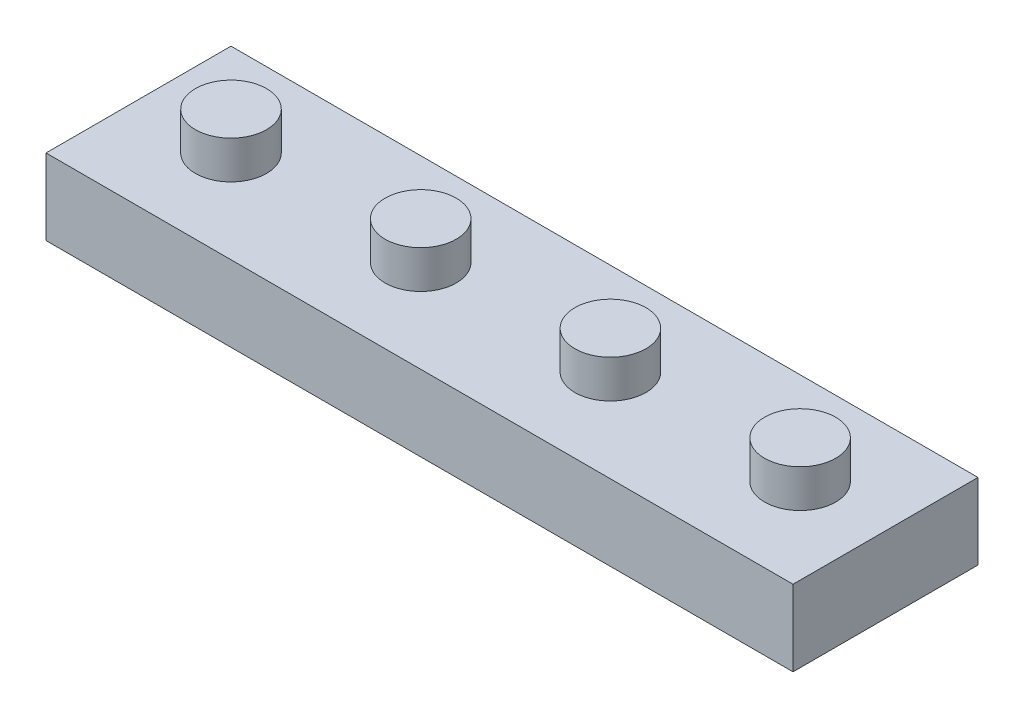
ISO-10303-21;
HEADER;
FILE_DESCRIPTION(('STEP AP214'),'2;1');
FILE_NAME('part.step','',(''),(''),'','','');
FILE_SCHEMA(('AUTOMOTIVE_DESIGN { 1 0 10303 214 1 1 1 1 }'));
ENDSEC;
DATA;
#1=APPLICATION_CONTEXT('core data for automotive mechanical design processes');
#2=APPLICATION_PROTOCOL_DEFINITION('international standard','automotive_design',2000,#1);
#3=PRODUCT_CONTEXT('',#1,'mechanical');
#4=PRODUCT('Part','Part','',(#3));
#5=PRODUCT_RELATED_PRODUCT_CATEGORY('part','',(#4));
#6=PRODUCT_DEFINITION_FORMATION('','',#4);
#7=PRODUCT_DEFINITION_CONTEXT('part definition',#1,'design');
#8=PRODUCT_DEFINITION('design','',#6,#7);
#9=PRODUCT_DEFINITION_SHAPE('','',#8);
#10=(LENGTH_UNIT() NAMED_UNIT(*) SI_UNIT(.MILLI.,.METRE.));
#11=(NAMED_UNIT(*) PLANE_ANGLE_UNIT() SI_UNIT($,.RADIAN.));
#12=(NAMED_UNIT(*) SI_UNIT($,.STERADIAN.) SOLID_ANGLE_UNIT());
#13=UNCERTAINTY_MEASURE_WITH_UNIT(LENGTH_MEASURE(1.E-05),#10,'distance_accuracy_value','');
#14=(GEOMETRIC_REPRESENTATION_CONTEXT(3) GLOBAL_UNCERTAINTY_ASSIGNED_CONTEXT((#13)) GLOBAL_UNIT_ASSIGNED_CONTEXT((#10,
#11,#12)) REPRESENTATION_CONTEXT('',''));
#15=CARTESIAN_POINT('',(0.,0.,0.));
#16=DIRECTION('',(0.,0.,1.));
#17=DIRECTION('',(1.,0.,0.));
#18=AXIS2_PLACEMENT_3D('',#15,#16,#17);
#19=CARTESIAN_POINT('',(0.,0.,-7.8));
#20=DIRECTION('',(0.,-1.,0.));
#21=DIRECTION('',(0.,0.,-1.));
#22=AXIS2_PLACEMENT_3D('',#19,#20,#21);
#23=PLANE('',#22);
#24=DIRECTION('',(1.,0.,0.));
#25=VECTOR('',#24,1.);
#26=CARTESIAN_POINT('',(0.,0.,0.));
#27=LINE('',#26,#25);
#28=CARTESIAN_POINT('',(0.,0.,0.));
#29=VERTEX_POINT('',#28);
#30=CARTESIAN_POINT('',(31.5,0.,0.));
#31=VERTEX_POINT('',#30);
#32=EDGE_CURVE('E223',#29,#31,#27,.T.);
#33=ORIENTED_EDGE('',*,*,#32,.F.);
#34=DIRECTION('',(0.,0.,1.));
#35=VECTOR('',#34,1.);
#36=CARTESIAN_POINT('',(0.,0.,-7.8));
#37=LINE('',#36,#35);
#38=CARTESIAN_POINT('',(0.,0.,-7.8));
#39=VERTEX_POINT('',#38);
#40=EDGE_CURVE('E94',#39,#29,#37,.T.);
#41=ORIENTED_EDGE('',*,*,#40,.F.);
#42=DIRECTION('',(1.,0.,0.));
#43=VECTOR('',#42,1.);
#44=CARTESIAN_POINT('',(0.,0.,-7.8));
#45=LINE('',#44,#43);
#46=CARTESIAN_POINT('',(31.5,0.,-7.8));
#47=VERTEX_POINT('',#46);
#48=EDGE_CURVE('E209',#39,#47,#45,.T.);
#49=ORIENTED_EDGE('',*,*,#48,.T.);
#50=DIRECTION('',(0.,0.,1.));
#51=VECTOR('',#50,1.);
#52=CARTESIAN_POINT('',(31.5,0.,-7.8));
#53=LINE('',#52,#51);
#54=EDGE_CURVE('E240',#47,#31,#53,.T.);
#55=ORIENTED_EDGE('',*,*,#54,.T.);
#56=EDGE_LOOP('',(#33,#41,#49,#55));
#57=FACE_BOUND('',#56,.T.);
#58=DIRECTION('',(0.,0.,1.));
#59=VECTOR('',#58,1.);
#60=CARTESIAN_POINT('',(1.2,0.,-7.8));
#61=LINE('',#60,#59);
#62=CARTESIAN_POINT('',(1.2,0.,-6.6));
#63=VERTEX_POINT('',#62);
#64=CARTESIAN_POINT('',(1.2,0.,-1.2));
#65=VERTEX_POINT('',#64);
#66=EDGE_CURVE('E142',#63,#65,#61,.T.);
#67=ORIENTED_EDGE('',*,*,#66,.T.);
#68=DIRECTION('',(1.,0.,0.));
#69=VECTOR('',#68,1.);
#70=CARTESIAN_POINT('',(0.,0.,-1.2));
#71=LINE('',#70,#69);
#72=CARTESIAN_POINT('',(30.3,0.,-1.2));
#73=VERTEX_POINT('',#72);
#74=EDGE_CURVE('E164',#65,#73,#71,.T.);
#75=ORIENTED_EDGE('',*,*,#74,.T.);
#76=DIRECTION('',(0.,0.,1.));
#77=VECTOR('',#76,1.);
#78=CARTESIAN_POINT('',(30.3,0.,-7.8));
#79=LINE('',#78,#77);
#80=CARTESIAN_POINT('',(30.3,0.,-6.6));
#81=VERTEX_POINT('',#80);
#82=EDGE_CURVE('E131',#81,#73,#79,.T.);
#83=ORIENTED_EDGE('',*,*,#82,.F.);
#84=DIRECTION('',(1.,0.,0.));
#85=VECTOR('',#84,1.);
#86=CARTESIAN_POINT('',(0.,0.,-6.6));
#87=LINE('',#86,#85);
#88=EDGE_CURVE('E59',#63,#81,#87,.T.);
#89=ORIENTED_EDGE('',*,*,#88,.F.);
#90=EDGE_LOOP('',(#67,#75,#83,#89));
#91=FACE_BOUND('',#90,.T.);
#92=ADVANCED_FACE('F43',(#57,#91),#23,.T.);
#93=CARTESIAN_POINT('',(27.9,4.8,-3.9));
#94=DIRECTION('',(0.,1.,0.));
#95=DIRECTION('',(0.,0.,1.));
#96=AXIS2_PLACEMENT_3D('',#93,#94,#95);
#97=PLANE('',#96);
#98=CARTESIAN_POINT('',(27.9,4.8,-3.9));
#99=DIRECTION('',(0.,1.,0.));
#100=DIRECTION('',(0.,0.,1.));
#101=AXIS2_PLACEMENT_3D('',#98,#99,#100);
#102=CIRCLE('',#101,1.5);
#103=CARTESIAN_POINT('',(27.9,4.8,-2.4));
#104=VERTEX_POINT('',#103);
#105=EDGE_CURVE('E256',#104,#104,#102,.T.);
#106=ORIENTED_EDGE('',*,*,#105,.T.);
#107=EDGE_LOOP('',(#106));
#108=FACE_BOUND('',#107,.T.);
#109=ADVANCED_FACE('F45',(#108),#97,.T.);
#110=CARTESIAN_POINT('',(27.9,4.8,-3.9));
#111=DIRECTION('',(0.,-1.,0.));
#112=DIRECTION('',(0.,0.,-1.));
#113=AXIS2_PLACEMENT_3D('',#110,#111,#112);
#114=CYLINDRICAL_SURFACE('',#113,1.5);
#115=ORIENTED_EDGE('',*,*,#105,.F.);
#116=EDGE_LOOP('',(#115));
#117=FACE_BOUND('',#116,.T.);
#118=CARTESIAN_POINT('',(27.9,3.2,-3.9));
#119=DIRECTION('',(0.,1.,0.));
#120=DIRECTION('',(0.,0.,1.));
#121=AXIS2_PLACEMENT_3D('',#118,#119,#120);
#122=CIRCLE('',#121,1.5);
#123=CARTESIAN_POINT('',(27.9,3.2,-2.4));
#124=VERTEX_POINT('',#123);
#125=EDGE_CURVE('E252',#124,#124,#122,.T.);
#126=ORIENTED_EDGE('',*,*,#125,.T.);
#127=EDGE_LOOP('',(#126));
#128=FACE_BOUND('',#127,.T.);
#129=ADVANCED_FACE('F300',(#117,#128),#114,.T.);
#130=CARTESIAN_POINT('',(19.9,4.8,-3.9));
#131=DIRECTION('',(0.,1.,0.));
#132=DIRECTION('',(0.,0.,1.));
#133=AXIS2_PLACEMENT_3D('',#130,#131,#132);
#134=PLANE('',#133);
#135=CARTESIAN_POINT('',(19.9,4.8,-3.9));
#136=DIRECTION('',(0.,1.,0.));
#137=DIRECTION('',(0.,0.,1.));
#138=AXIS2_PLACEMENT_3D('',#135,#136,#137);
#139=CIRCLE('',#138,1.5);
#140=CARTESIAN_POINT('',(19.9,4.8,-2.4));
#141=VERTEX_POINT('',#140);
#142=EDGE_CURVE('E248',#141,#141,#139,.T.);
#143=ORIENTED_EDGE('',*,*,#142,.T.);
#144=EDGE_LOOP('',(#143));
#145=FACE_BOUND('',#144,.T.);
#146=ADVANCED_FACE('F313',(#145),#134,.T.);
#147=CARTESIAN_POINT('',(19.9,4.8,-3.9));
#148=DIRECTION('',(0.,-1.,0.));
#149=DIRECTION('',(0.,0.,-1.));
#150=AXIS2_PLACEMENT_3D('',#147,#148,#149);
#151=CYLINDRICAL_SURFACE('',#150,1.5);
#152=ORIENTED_EDGE('',*,*,#142,.F.);
#153=EDGE_LOOP('',(#152));
#154=FACE_BOUND('',#153,.T.);
#155=CARTESIAN_POINT('',(19.9,3.2,-3.9));
#156=DIRECTION('',(0.,1.,0.));
#157=DIRECTION('',(0.,0.,1.));
#158=AXIS2_PLACEMENT_3D('',#155,#156,#157);
#159=CIRCLE('',#158,1.5);
#160=CARTESIAN_POINT('',(19.9,3.2,-2.4));
#161=VERTEX_POINT('',#160);
#162=EDGE_CURVE('E236',#161,#161,#159,.T.);
#163=ORIENTED_EDGE('',*,*,#162,.T.);
#164=EDGE_LOOP('',(#163));
#165=FACE_BOUND('',#164,.T.);
#166=ADVANCED_FACE('F310',(#154,#165),#151,.T.);
#167=CARTESIAN_POINT('',(0.,0.,-7.8));
#168=DIRECTION('',(-1.,0.,0.));
#169=DIRECTION('',(0.,0.,1.));
#170=AXIS2_PLACEMENT_3D('',#167,#168,#169);
#171=PLANE('',#170);
#172=DIRECTION('',(0.,-1.,0.));
#173=VECTOR('',#172,1.);
#174=CARTESIAN_POINT('',(0.,0.,0.));
#175=LINE('',#174,#173);
#176=CARTESIAN_POINT('',(0.,3.2,0.));
#177=VERTEX_POINT('',#176);
#178=EDGE_CURVE('E202',#177,#29,#175,.T.);
#179=ORIENTED_EDGE('',*,*,#178,.F.);
#180=DIRECTION('',(0.,0.,1.));
#181=VECTOR('',#180,1.);
#182=CARTESIAN_POINT('',(0.,3.2,-7.8));
#183=LINE('',#182,#181);
#184=CARTESIAN_POINT('',(0.,3.2,-7.8));
#185=VERTEX_POINT('',#184);
#186=EDGE_CURVE('E68',#185,#177,#183,.T.);
#187=ORIENTED_EDGE('',*,*,#186,.F.);
#188=DIRECTION('',(0.,-1.,0.));
#189=VECTOR('',#188,1.);
#190=CARTESIAN_POINT('',(0.,0.,-7.8));
#191=LINE('',#190,#189);
#192=EDGE_CURVE('E206',#185,#39,#191,.T.);
#193=ORIENTED_EDGE('',*,*,#192,.T.);
#194=ORIENTED_EDGE('',*,*,#40,.T.);
#195=EDGE_LOOP('',(#179,#187,#193,#194));
#196=FACE_BOUND('',#195,.T.);
#197=ADVANCED_FACE('F306',(#196),#171,.T.);
#198=CARTESIAN_POINT('',(0.,3.2,-7.8));
#199=DIRECTION('',(0.,1.,0.));
#200=DIRECTION('',(0.,0.,1.));
#201=AXIS2_PLACEMENT_3D('',#198,#199,#200);
#202=PLANE('',#201);
#203=CARTESIAN_POINT('',(11.9,3.2,-3.9));
#204=DIRECTION('',(0.,1.,0.));
#205=DIRECTION('',(0.,0.,1.));
#206=AXIS2_PLACEMENT_3D('',#203,#204,#205);
#207=CIRCLE('',#206,1.5);
#208=CARTESIAN_POINT('',(11.9,3.2,-2.4));
#209=VERTEX_POINT('',#208);
#210=EDGE_CURVE('E188',#209,#209,#207,.T.);
#211=ORIENTED_EDGE('',*,*,#210,.F.);
#212=EDGE_LOOP('',(#211));
#213=FACE_BOUND('',#212,.T.);
#214=CARTESIAN_POINT('',(3.9,3.2,-3.9));
#215=DIRECTION('',(0.,1.,0.));
#216=DIRECTION('',(0.,0.,1.));
#217=AXIS2_PLACEMENT_3D('',#214,#215,#216);
#218=CIRCLE('',#217,1.5);
#219=CARTESIAN_POINT('',(3.9,3.2,-2.4));
#220=VERTEX_POINT('',#219);
#221=EDGE_CURVE('E197',#220,#220,#218,.T.);
#222=ORIENTED_EDGE('',*,*,#221,.F.);
#223=EDGE_LOOP('',(#222));
#224=FACE_BOUND('',#223,.T.);
#225=DIRECTION('',(-1.,0.,0.));
#226=VECTOR('',#225,1.);
#227=CARTESIAN_POINT('',(0.,3.2,0.));
#228=LINE('',#227,#226);
#229=CARTESIAN_POINT('',(31.5,3.2,0.));
#230=VERTEX_POINT('',#229);
#231=EDGE_CURVE('E210',#230,#177,#228,.T.);
#232=ORIENTED_EDGE('',*,*,#231,.F.);
#233=DIRECTION('',(0.,0.,1.));
#234=VECTOR('',#233,1.);
#235=CARTESIAN_POINT('',(31.5,3.2,-7.8));
#236=LINE('',#235,#234);
#237=CARTESIAN_POINT('',(31.5,3.2,-7.8));
#238=VERTEX_POINT('',#237);
#239=EDGE_CURVE('E237',#238,#230,#236,.T.);
#240=ORIENTED_EDGE('',*,*,#239,.F.);
#241=DIRECTION('',(-1.,0.,0.));
#242=VECTOR('',#241,1.);
#243=CARTESIAN_POINT('',(0.,3.2,-7.8));
#244=LINE('',#243,#242);
#245=EDGE_CURVE('E217',#238,#185,#244,.T.);
#246=ORIENTED_EDGE('',*,*,#245,.T.);
#247=ORIENTED_EDGE('',*,*,#186,.T.);
#248=EDGE_LOOP('',(#232,#240,#246,#247));
#249=FACE_BOUND('',#248,.T.);
#250=ORIENTED_EDGE('',*,*,#162,.F.);
#251=EDGE_LOOP('',(#250));
#252=FACE_BOUND('',#251,.T.);
#253=ORIENTED_EDGE('',*,*,#125,.F.);
#254=EDGE_LOOP('',(#253));
#255=FACE_BOUND('',#254,.T.);
#256=ADVANCED_FACE('F309',(#213,#224,#249,#252,#255),#202,.T.);
#257=CARTESIAN_POINT('',(31.5,0.,-7.8));
#258=DIRECTION('',(1.,0.,0.));
#259=DIRECTION('',(0.,0.,-1.));
#260=AXIS2_PLACEMENT_3D('',#257,#258,#259);
#261=PLANE('',#260);
#262=DIRECTION('',(0.,1.,0.));
#263=VECTOR('',#262,1.);
#264=CARTESIAN_POINT('',(31.5,0.,0.));
#265=LINE('',#264,#263);
#266=EDGE_CURVE('E227',#31,#230,#265,.T.);
#267=ORIENTED_EDGE('',*,*,#266,.F.);
#268=ORIENTED_EDGE('',*,*,#54,.F.);
#269=DIRECTION('',(0.,1.,0.));
#270=VECTOR('',#269,1.);
#271=CARTESIAN_POINT('',(31.5,0.,-7.8));
#272=LINE('',#271,#270);
#273=EDGE_CURVE('E213',#47,#238,#272,.T.);
#274=ORIENTED_EDGE('',*,*,#273,.T.);
#275=ORIENTED_EDGE('',*,*,#239,.T.);
#276=EDGE_LOOP('',(#267,#268,#274,#275));
#277=FACE_BOUND('',#276,.T.);
#278=ADVANCED_FACE('F304',(#277),#261,.T.);
#279=CARTESIAN_POINT('',(0.,0.,-7.8));
#280=DIRECTION('',(0.,0.,-1.));
#281=DIRECTION('',(-1.,0.,0.));
#282=AXIS2_PLACEMENT_3D('',#279,#280,#281);
#283=PLANE('',#282);
#284=ORIENTED_EDGE('',*,*,#192,.F.);
#285=ORIENTED_EDGE('',*,*,#245,.F.);
#286=ORIENTED_EDGE('',*,*,#273,.F.);
#287=ORIENTED_EDGE('',*,*,#48,.F.);
#288=EDGE_LOOP('',(#284,#285,#286,#287));
#289=FACE_BOUND('',#288,.T.);
#290=ADVANCED_FACE('F330',(#289),#283,.T.);
#291=CARTESIAN_POINT('',(0.,0.,0.));
#292=DIRECTION('',(0.,0.,-1.));
#293=DIRECTION('',(-1.,0.,0.));
#294=AXIS2_PLACEMENT_3D('',#291,#292,#293);
#295=PLANE('',#294);
#296=ORIENTED_EDGE('',*,*,#178,.T.);
#297=ORIENTED_EDGE('',*,*,#32,.T.);
#298=ORIENTED_EDGE('',*,*,#266,.T.);
#299=ORIENTED_EDGE('',*,*,#231,.T.);
#300=EDGE_LOOP('',(#296,#297,#298,#299));
#301=FACE_BOUND('',#300,.T.);
#302=ADVANCED_FACE('F335',(#301),#295,.F.);
#303=CARTESIAN_POINT('',(3.9,4.8,-3.9));
#304=DIRECTION('',(0.,-1.,0.));
#305=DIRECTION('',(0.,0.,-1.));
#306=AXIS2_PLACEMENT_3D('',#303,#304,#305);
#307=CYLINDRICAL_SURFACE('',#306,1.5);
#308=CARTESIAN_POINT('',(3.9,4.8,-3.9));
#309=DIRECTION('',(0.,1.,0.));
#310=DIRECTION('',(0.,0.,1.));
#311=AXIS2_PLACEMENT_3D('',#308,#309,#310);
#312=CIRCLE('',#311,1.5);
#313=CARTESIAN_POINT('',(3.9,4.8,-2.4));
#314=VERTEX_POINT('',#313);
#315=EDGE_CURVE('E198',#314,#314,#312,.T.);
#316=ORIENTED_EDGE('',*,*,#315,.F.);
#317=EDGE_LOOP('',(#316));
#318=FACE_BOUND('',#317,.T.);
#319=ORIENTED_EDGE('',*,*,#221,.T.);
#320=EDGE_LOOP('',(#319));
#321=FACE_BOUND('',#320,.T.);
#322=ADVANCED_FACE('F338',(#318,#321),#307,.T.);
#323=CARTESIAN_POINT('',(3.9,4.8,-3.9));
#324=DIRECTION('',(0.,1.,0.));
#325=DIRECTION('',(0.,0.,1.));
#326=AXIS2_PLACEMENT_3D('',#323,#324,#325);
#327=PLANE('',#326);
#328=ORIENTED_EDGE('',*,*,#315,.T.);
#329=EDGE_LOOP('',(#328));
#330=FACE_BOUND('',#329,.T.);
#331=ADVANCED_FACE('F345',(#330),#327,.T.);
#332=CARTESIAN_POINT('',(11.9,4.8,-3.9));
#333=DIRECTION('',(0.,-1.,0.));
#334=DIRECTION('',(0.,0.,-1.));
#335=AXIS2_PLACEMENT_3D('',#332,#333,#334);
#336=CYLINDRICAL_SURFACE('',#335,1.5);
#337=CARTESIAN_POINT('',(11.9,4.8,-3.9));
#338=DIRECTION('',(0.,1.,0.));
#339=DIRECTION('',(0.,0.,1.));
#340=AXIS2_PLACEMENT_3D('',#337,#338,#339);
#341=CIRCLE('',#340,1.5);
#342=CARTESIAN_POINT('',(11.9,4.8,-2.4));
#343=VERTEX_POINT('',#342);
#344=EDGE_CURVE('E192',#343,#343,#341,.T.);
#345=ORIENTED_EDGE('',*,*,#344,.F.);
#346=EDGE_LOOP('',(#345));
#347=FACE_BOUND('',#346,.T.);
#348=ORIENTED_EDGE('',*,*,#210,.T.);
#349=EDGE_LOOP('',(#348));
#350=FACE_BOUND('',#349,.T.);
#351=ADVANCED_FACE('F349',(#347,#350),#336,.T.);
#352=CARTESIAN_POINT('',(11.9,4.8,-3.9));
#353=DIRECTION('',(0.,1.,0.));
#354=DIRECTION('',(0.,0.,1.));
#355=AXIS2_PLACEMENT_3D('',#352,#353,#354);
#356=PLANE('',#355);
#357=ORIENTED_EDGE('',*,*,#344,.T.);
#358=EDGE_LOOP('',(#357));
#359=FACE_BOUND('',#358,.T.);
#360=ADVANCED_FACE('F353',(#359),#356,.T.);
#361=CARTESIAN_POINT('',(27.9,3.6,-3.9));
#362=DIRECTION('',(0.,1.,0.));
#363=DIRECTION('',(0.,0.,1.));
#364=AXIS2_PLACEMENT_3D('',#361,#362,#363);
#365=PLANE('',#364);
#366=CARTESIAN_POINT('',(27.9,3.6,-3.9));
#367=DIRECTION('',(0.,1.,0.));
#368=DIRECTION('',(0.,0.,1.));
#369=AXIS2_PLACEMENT_3D('',#366,#367,#368);
#370=CIRCLE('',#369,0.300000000000001);
#371=CARTESIAN_POINT('',(27.9,3.6,-3.6));
#372=VERTEX_POINT('',#371);
#373=EDGE_CURVE('E193',#372,#372,#370,.T.);
#374=ORIENTED_EDGE('',*,*,#373,.F.);
#375=EDGE_LOOP('',(#374));
#376=FACE_BOUND('',#375,.T.);
#377=ADVANCED_FACE('F357',(#376),#365,.F.);
#378=CARTESIAN_POINT('',(27.9,4.8,-3.9));
#379=DIRECTION('',(0.,-1.,0.));
#380=DIRECTION('',(0.,0.,-1.));
#381=AXIS2_PLACEMENT_3D('',#378,#379,#380);
#382=CYLINDRICAL_SURFACE('',#381,0.300000000000001);
#383=ORIENTED_EDGE('',*,*,#373,.T.);
#384=EDGE_LOOP('',(#383));
#385=FACE_BOUND('',#384,.T.);
#386=CARTESIAN_POINT('',(27.9,2.,-3.9));
#387=DIRECTION('',(0.,1.,0.));
#388=DIRECTION('',(0.,0.,1.));
#389=AXIS2_PLACEMENT_3D('',#386,#387,#388);
#390=CIRCLE('',#389,0.300000000000001);
#391=CARTESIAN_POINT('',(27.9,2.,-3.6));
#392=VERTEX_POINT('',#391);
#393=EDGE_CURVE('E159',#392,#392,#390,.T.);
#394=ORIENTED_EDGE('',*,*,#393,.F.);
#395=EDGE_LOOP('',(#394));
#396=FACE_BOUND('',#395,.T.);
#397=ADVANCED_FACE('F391',(#385,#396),#382,.F.);
#398=CARTESIAN_POINT('',(19.9,3.6,-3.9));
#399=DIRECTION('',(0.,1.,0.));
#400=DIRECTION('',(0.,0.,1.));
#401=AXIS2_PLACEMENT_3D('',#398,#399,#400);
#402=PLANE('',#401);
#403=CARTESIAN_POINT('',(19.9,3.6,-3.9));
#404=DIRECTION('',(0.,1.,0.));
#405=DIRECTION('',(0.,0.,1.));
#406=AXIS2_PLACEMENT_3D('',#403,#404,#405);
#407=CIRCLE('',#406,0.300000000000001);
#408=CARTESIAN_POINT('',(19.9,3.6,-3.6));
#409=VERTEX_POINT('',#408);
#410=EDGE_CURVE('E155',#409,#409,#407,.T.);
#411=ORIENTED_EDGE('',*,*,#410,.F.);
#412=EDGE_LOOP('',(#411));
#413=FACE_BOUND('',#412,.T.);
#414=ADVANCED_FACE('F387',(#413),#402,.F.);
#415=CARTESIAN_POINT('',(19.9,4.8,-3.9));
#416=DIRECTION('',(0.,-1.,0.));
#417=DIRECTION('',(0.,0.,-1.));
#418=AXIS2_PLACEMENT_3D('',#415,#416,#417);
#419=CYLINDRICAL_SURFACE('',#418,0.300000000000001);
#420=ORIENTED_EDGE('',*,*,#410,.T.);
#421=EDGE_LOOP('',(#420));
#422=FACE_BOUND('',#421,.T.);
#423=CARTESIAN_POINT('',(19.9,2.,-3.9));
#424=DIRECTION('',(0.,1.,0.));
#425=DIRECTION('',(0.,0.,1.));
#426=AXIS2_PLACEMENT_3D('',#423,#424,#425);
#427=CIRCLE('',#426,0.300000000000001);
#428=CARTESIAN_POINT('',(19.9,2.,-3.6));
#429=VERTEX_POINT('',#428);
#430=EDGE_CURVE('E151',#429,#429,#427,.T.);
#431=ORIENTED_EDGE('',*,*,#430,.F.);
#432=EDGE_LOOP('',(#431));
#433=FACE_BOUND('',#432,.T.);
#434=ADVANCED_FACE('F384',(#422,#433),#419,.F.);
#435=CARTESIAN_POINT('',(1.2,0.,-7.8));
#436=DIRECTION('',(-1.,0.,0.));
#437=DIRECTION('',(0.,0.,1.));
#438=AXIS2_PLACEMENT_3D('',#435,#436,#437);
#439=PLANE('',#438);
#440=DIRECTION('',(0.,-1.,0.));
#441=VECTOR('',#440,1.);
#442=CARTESIAN_POINT('',(1.2,0.,-1.2));
#443=LINE('',#442,#441);
#444=CARTESIAN_POINT('',(1.2,2.,-1.2));
#445=VERTEX_POINT('',#444);
#446=EDGE_CURVE('E160',#445,#65,#443,.T.);
#447=ORIENTED_EDGE('',*,*,#446,.T.);
#448=ORIENTED_EDGE('',*,*,#66,.F.);
#449=DIRECTION('',(0.,-1.,0.));
#450=VECTOR('',#449,1.);
#451=CARTESIAN_POINT('',(1.2,0.,-6.6));
#452=LINE('',#451,#450);
#453=CARTESIAN_POINT('',(1.2,2.,-6.6));
#454=VERTEX_POINT('',#453);
#455=EDGE_CURVE('E166',#454,#63,#452,.T.);
#456=ORIENTED_EDGE('',*,*,#455,.F.);
#457=DIRECTION('',(0.,0.,1.));
#458=VECTOR('',#457,1.);
#459=CARTESIAN_POINT('',(1.2,2.,-7.8));
#460=LINE('',#459,#458);
#461=EDGE_CURVE('E130',#454,#445,#460,.T.);
#462=ORIENTED_EDGE('',*,*,#461,.T.);
#463=EDGE_LOOP('',(#447,#448,#456,#462));
#464=FACE_BOUND('',#463,.T.);
#465=ADVANCED_FACE('F272',(#464),#439,.F.);
#466=CARTESIAN_POINT('',(0.,2.,-7.8));
#467=DIRECTION('',(0.,1.,0.));
#468=DIRECTION('',(0.,0.,1.));
#469=AXIS2_PLACEMENT_3D('',#466,#467,#468);
#470=PLANE('',#469);
#471=CARTESIAN_POINT('',(23.9,2.,-3.9));
#472=DIRECTION('',(0.,1.,0.));
#473=DIRECTION('',(0.,0.,1.));
#474=AXIS2_PLACEMENT_3D('',#471,#472,#473);
#475=CIRCLE('',#474,1.5);
#476=CARTESIAN_POINT('',(23.9,2.,-2.4));
#477=VERTEX_POINT('',#476);
#478=EDGE_CURVE('E12',#477,#477,#475,.F.);
#479=ORIENTED_EDGE('',*,*,#478,.F.);
#480=EDGE_LOOP('',(#479));
#481=FACE_BOUND('',#480,.T.);
#482=CARTESIAN_POINT('',(15.9,2.,-3.9));
#483=DIRECTION('',(0.,1.,0.));
#484=DIRECTION('',(0.,0.,1.));
#485=AXIS2_PLACEMENT_3D('',#482,#483,#484);
#486=CIRCLE('',#485,1.5);
#487=CARTESIAN_POINT('',(15.9,2.,-2.4));
#488=VERTEX_POINT('',#487);
#489=EDGE_CURVE('E52',#488,#488,#486,.F.);
#490=ORIENTED_EDGE('',*,*,#489,.F.);
#491=EDGE_LOOP('',(#490));
#492=FACE_BOUND('',#491,.T.);
#493=CARTESIAN_POINT('',(7.9,2.,-3.9));
#494=DIRECTION('',(0.,1.,0.));
#495=DIRECTION('',(0.,0.,1.));
#496=AXIS2_PLACEMENT_3D('',#493,#494,#495);
#497=CIRCLE('',#496,1.5);
#498=CARTESIAN_POINT('',(7.9,2.,-2.4));
#499=VERTEX_POINT('',#498);
#500=EDGE_CURVE('E260',#499,#499,#497,.F.);
#501=ORIENTED_EDGE('',*,*,#500,.F.);
#502=EDGE_LOOP('',(#501));
#503=FACE_BOUND('',#502,.T.);
#504=CARTESIAN_POINT('',(11.9,2.,-3.9));
#505=DIRECTION('',(0.,1.,0.));
#506=DIRECTION('',(0.,0.,1.));
#507=AXIS2_PLACEMENT_3D('',#504,#505,#506);
#508=CIRCLE('',#507,0.300000000000001);
#509=CARTESIAN_POINT('',(11.9,2.,-3.6));
#510=VERTEX_POINT('',#509);
#511=EDGE_CURVE('E179',#510,#510,#508,.T.);
#512=ORIENTED_EDGE('',*,*,#511,.T.);
#513=EDGE_LOOP('',(#512));
#514=FACE_BOUND('',#513,.T.);
#515=CARTESIAN_POINT('',(3.9,2.,-3.9));
#516=DIRECTION('',(0.,1.,0.));
#517=DIRECTION('',(0.,0.,1.));
#518=AXIS2_PLACEMENT_3D('',#515,#516,#517);
#519=CIRCLE('',#518,0.300000000000001);
#520=CARTESIAN_POINT('',(3.9,2.,-3.6));
#521=VERTEX_POINT('',#520);
#522=EDGE_CURVE('E175',#521,#521,#519,.T.);
#523=ORIENTED_EDGE('',*,*,#522,.T.);
#524=EDGE_LOOP('',(#523));
#525=FACE_BOUND('',#524,.T.);
#526=DIRECTION('',(-1.,0.,0.));
#527=VECTOR('',#526,1.);
#528=CARTESIAN_POINT('',(0.,2.,-1.2));
#529=LINE('',#528,#527);
#530=CARTESIAN_POINT('',(30.3,2.,-1.2));
#531=VERTEX_POINT('',#530);
#532=EDGE_CURVE('E168',#531,#445,#529,.T.);
#533=ORIENTED_EDGE('',*,*,#532,.T.);
#534=ORIENTED_EDGE('',*,*,#461,.F.);
#535=DIRECTION('',(-1.,0.,0.));
#536=VECTOR('',#535,1.);
#537=CARTESIAN_POINT('',(0.,2.,-6.6));
#538=LINE('',#537,#536);
#539=CARTESIAN_POINT('',(30.3,2.,-6.6));
#540=VERTEX_POINT('',#539);
#541=EDGE_CURVE('E135',#540,#454,#538,.T.);
#542=ORIENTED_EDGE('',*,*,#541,.F.);
#543=DIRECTION('',(0.,0.,1.));
#544=VECTOR('',#543,1.);
#545=CARTESIAN_POINT('',(30.3,2.,-7.8));
#546=LINE('',#545,#544);
#547=EDGE_CURVE('E119',#540,#531,#546,.T.);
#548=ORIENTED_EDGE('',*,*,#547,.T.);
#549=EDGE_LOOP('',(#533,#534,#542,#548));
#550=FACE_BOUND('',#549,.T.);
#551=ORIENTED_EDGE('',*,*,#430,.T.);
#552=EDGE_LOOP('',(#551));
#553=FACE_BOUND('',#552,.T.);
#554=ORIENTED_EDGE('',*,*,#393,.T.);
#555=EDGE_LOOP('',(#554));
#556=FACE_BOUND('',#555,.T.);
#557=ADVANCED_FACE('F138',(#481,#492,#503,#514,#525,#550,#553,#556),#470,.F.);
#558=CARTESIAN_POINT('',(30.3,0.,-7.8));
#559=DIRECTION('',(1.,0.,0.));
#560=DIRECTION('',(0.,0.,-1.));
#561=AXIS2_PLACEMENT_3D('',#558,#559,#560);
#562=PLANE('',#561);
#563=DIRECTION('',(0.,1.,0.));
#564=VECTOR('',#563,1.);
#565=CARTESIAN_POINT('',(30.3,0.,-1.2));
#566=LINE('',#565,#564);
#567=EDGE_CURVE('E124',#73,#531,#566,.T.);
#568=ORIENTED_EDGE('',*,*,#567,.T.);
#569=ORIENTED_EDGE('',*,*,#547,.F.);
#570=DIRECTION('',(0.,1.,0.));
#571=VECTOR('',#570,1.);
#572=CARTESIAN_POINT('',(30.3,0.,-6.6));
#573=LINE('',#572,#571);
#574=EDGE_CURVE('E121',#81,#540,#573,.T.);
#575=ORIENTED_EDGE('',*,*,#574,.F.);
#576=ORIENTED_EDGE('',*,*,#82,.T.);
#577=EDGE_LOOP('',(#568,#569,#575,#576));
#578=FACE_BOUND('',#577,.T.);
#579=ADVANCED_FACE('F120',(#578),#562,.F.);
#580=CARTESIAN_POINT('',(0.,0.,-6.6));
#581=DIRECTION('',(0.,0.,-1.));
#582=DIRECTION('',(-1.,0.,0.));
#583=AXIS2_PLACEMENT_3D('',#580,#581,#582);
#584=PLANE('',#583);
#585=ORIENTED_EDGE('',*,*,#455,.T.);
#586=ORIENTED_EDGE('',*,*,#88,.T.);
#587=ORIENTED_EDGE('',*,*,#574,.T.);
#588=ORIENTED_EDGE('',*,*,#541,.T.);
#589=EDGE_LOOP('',(#585,#586,#587,#588));
#590=FACE_BOUND('',#589,.T.);
#591=ADVANCED_FACE('F134',(#590),#584,.F.);
#592=CARTESIAN_POINT('',(0.,0.,-1.2));
#593=DIRECTION('',(0.,0.,-1.));
#594=DIRECTION('',(-1.,0.,0.));
#595=AXIS2_PLACEMENT_3D('',#592,#593,#594);
#596=PLANE('',#595);
#597=ORIENTED_EDGE('',*,*,#446,.F.);
#598=ORIENTED_EDGE('',*,*,#532,.F.);
#599=ORIENTED_EDGE('',*,*,#567,.F.);
#600=ORIENTED_EDGE('',*,*,#74,.F.);
#601=EDGE_LOOP('',(#597,#598,#599,#600));
#602=FACE_BOUND('',#601,.T.);
#603=ADVANCED_FACE('F292',(#602),#596,.T.);
#604=CARTESIAN_POINT('',(3.9,4.8,-3.9));
#605=DIRECTION('',(0.,-1.,0.));
#606=DIRECTION('',(0.,0.,-1.));
#607=AXIS2_PLACEMENT_3D('',#604,#605,#606);
#608=CYLINDRICAL_SURFACE('',#607,0.300000000000001);
#609=CARTESIAN_POINT('',(3.9,3.6,-3.9));
#610=DIRECTION('',(0.,1.,0.));
#611=DIRECTION('',(0.,0.,1.));
#612=AXIS2_PLACEMENT_3D('',#609,#610,#611);
#613=CIRCLE('',#612,0.300000000000001);
#614=CARTESIAN_POINT('',(3.9,3.6,-3.6));
#615=VERTEX_POINT('',#614);
#616=EDGE_CURVE('E165',#615,#615,#613,.T.);
#617=ORIENTED_EDGE('',*,*,#616,.T.);
#618=EDGE_LOOP('',(#617));
#619=FACE_BOUND('',#618,.T.);
#620=ORIENTED_EDGE('',*,*,#522,.F.);
#621=EDGE_LOOP('',(#620));
#622=FACE_BOUND('',#621,.T.);
#623=ADVANCED_FACE('F371',(#619,#622),#608,.F.);
#624=CARTESIAN_POINT('',(3.9,3.6,-3.9));
#625=DIRECTION('',(0.,1.,0.));
#626=DIRECTION('',(0.,0.,1.));
#627=AXIS2_PLACEMENT_3D('',#624,#625,#626);
#628=PLANE('',#627);
#629=ORIENTED_EDGE('',*,*,#616,.F.);
#630=EDGE_LOOP('',(#629));
#631=FACE_BOUND('',#630,.T.);
#632=ADVANCED_FACE('F367',(#631),#628,.F.);
#633=CARTESIAN_POINT('',(11.9,4.8,-3.9));
#634=DIRECTION('',(0.,-1.,0.));
#635=DIRECTION('',(0.,0.,-1.));
#636=AXIS2_PLACEMENT_3D('',#633,#634,#635);
#637=CYLINDRICAL_SURFACE('',#636,0.300000000000001);
#638=CARTESIAN_POINT('',(11.9,3.6,-3.9));
#639=DIRECTION('',(0.,1.,0.));
#640=DIRECTION('',(0.,0.,1.));
#641=AXIS2_PLACEMENT_3D('',#638,#639,#640);
#642=CIRCLE('',#641,0.300000000000001);
#643=CARTESIAN_POINT('',(11.9,3.6,-3.6));
#644=VERTEX_POINT('',#643);
#645=EDGE_CURVE('E176',#644,#644,#642,.T.);
#646=ORIENTED_EDGE('',*,*,#645,.T.);
#647=EDGE_LOOP('',(#646));
#648=FACE_BOUND('',#647,.T.);
#649=ORIENTED_EDGE('',*,*,#511,.F.);
#650=EDGE_LOOP('',(#649));
#651=FACE_BOUND('',#650,.T.);
#652=ADVANCED_FACE('F363',(#648,#651),#637,.F.);
#653=CARTESIAN_POINT('',(11.9,3.6,-3.9));
#654=DIRECTION('',(0.,1.,0.));
#655=DIRECTION('',(0.,0.,1.));
#656=AXIS2_PLACEMENT_3D('',#653,#654,#655);
#657=PLANE('',#656);
#658=ORIENTED_EDGE('',*,*,#645,.F.);
#659=EDGE_LOOP('',(#658));
#660=FACE_BOUND('',#659,.T.);
#661=ADVANCED_FACE('F359',(#660),#657,.F.);
#662=CARTESIAN_POINT('',(7.9,-4.24264068711929,-3.9));
#663=DIRECTION('',(0.,1.,0.));
#664=DIRECTION('',(0.,0.,1.));
#665=AXIS2_PLACEMENT_3D('',#662,#663,#664);
#666=CYLINDRICAL_SURFACE('',#665,1.5);
#667=ORIENTED_EDGE('',*,*,#500,.T.);
#668=EDGE_LOOP('',(#667));
#669=FACE_BOUND('',#668,.T.);
#670=CARTESIAN_POINT('',(7.9,0.2,-3.9));
#671=DIRECTION('',(0.,-1.,0.));
#672=DIRECTION('',(0.,0.,-1.));
#673=AXIS2_PLACEMENT_3D('',#670,#671,#672);
#674=CIRCLE('',#673,1.5);
#675=CARTESIAN_POINT('',(7.9,0.2,-5.4));
#676=VERTEX_POINT('',#675);
#677=EDGE_CURVE('E466',#676,#676,#674,.T.);
#678=ORIENTED_EDGE('',*,*,#677,.F.);
#679=EDGE_LOOP('',(#678));
#680=FACE_BOUND('',#679,.T.);
#681=ADVANCED_FACE('F362',(#669,#680),#666,.T.);
#682=CARTESIAN_POINT('',(7.9,-4.24264068711929,-3.9));
#683=DIRECTION('',(0.,1.,0.));
#684=DIRECTION('',(0.,0.,1.));
#685=AXIS2_PLACEMENT_3D('',#682,#683,#684);
#686=CYLINDRICAL_SURFACE('',#685,0.6);
#687=CARTESIAN_POINT('',(7.9,2.,-3.9));
#688=DIRECTION('',(0.,-1.,0.));
#689=DIRECTION('',(0.,0.,-1.));
#690=AXIS2_PLACEMENT_3D('',#687,#688,#689);
#691=CIRCLE('',#690,0.6);
#692=CARTESIAN_POINT('',(7.9,2.,-4.5));
#693=VERTEX_POINT('',#692);
#694=EDGE_CURVE('E470',#693,#693,#691,.T.);
#695=ORIENTED_EDGE('',*,*,#694,.F.);
#696=EDGE_LOOP('',(#695));
#697=FACE_BOUND('',#696,.T.);
#698=CARTESIAN_POINT('',(7.9,0.2,-3.9));
#699=DIRECTION('',(0.,-1.,0.));
#700=DIRECTION('',(0.,0.,-1.));
#701=AXIS2_PLACEMENT_3D('',#698,#699,#700);
#702=CIRCLE('',#701,0.6);
#703=CARTESIAN_POINT('',(7.9,0.2,-4.5));
#704=VERTEX_POINT('',#703);
#705=EDGE_CURVE('E462',#704,#704,#702,.T.);
#706=ORIENTED_EDGE('',*,*,#705,.T.);
#707=EDGE_LOOP('',(#706));
#708=FACE_BOUND('',#707,.T.);
#709=ADVANCED_FACE('F401',(#697,#708),#686,.F.);
#710=CARTESIAN_POINT('',(0.,0.2,-7.8));
#711=DIRECTION('',(0.,-1.,0.));
#712=DIRECTION('',(0.,0.,-1.));
#713=AXIS2_PLACEMENT_3D('',#710,#711,#712);
#714=PLANE('',#713);
#715=ORIENTED_EDGE('',*,*,#705,.F.);
#716=EDGE_LOOP('',(#715));
#717=FACE_BOUND('',#716,.T.);
#718=ORIENTED_EDGE('',*,*,#677,.T.);
#719=EDGE_LOOP('',(#718));
#720=FACE_BOUND('',#719,.T.);
#721=ADVANCED_FACE('F405',(#717,#720),#714,.T.);
#722=ORIENTED_EDGE('',*,*,#694,.T.);
#723=EDGE_LOOP('',(#722));
#724=FACE_BOUND('',#723,.T.);
#725=ADVANCED_FACE('F276',(#724),#470,.F.);
#726=CARTESIAN_POINT('',(15.9,-4.24264068711929,-3.9));
#727=DIRECTION('',(0.,1.,0.));
#728=DIRECTION('',(0.,0.,1.));
#729=AXIS2_PLACEMENT_3D('',#726,#727,#728);
#730=CYLINDRICAL_SURFACE('',#729,1.5);
#731=ORIENTED_EDGE('',*,*,#489,.T.);
#732=EDGE_LOOP('',(#731));
#733=FACE_BOUND('',#732,.T.);
#734=CARTESIAN_POINT('',(15.9,0.2,-3.9));
#735=DIRECTION('',(0.,-1.,0.));
#736=DIRECTION('',(0.,0.,-1.));
#737=AXIS2_PLACEMENT_3D('',#734,#735,#736);
#738=CIRCLE('',#737,1.5);
#739=CARTESIAN_POINT('',(15.9,0.2,-5.4));
#740=VERTEX_POINT('',#739);
#741=EDGE_CURVE('E458',#740,#740,#738,.T.);
#742=ORIENTED_EDGE('',*,*,#741,.F.);
#743=EDGE_LOOP('',(#742));
#744=FACE_BOUND('',#743,.T.);
#745=ADVANCED_FACE('F267',(#733,#744),#730,.T.);
#746=CARTESIAN_POINT('',(15.9,-4.24264068711929,-3.9));
#747=DIRECTION('',(0.,1.,0.));
#748=DIRECTION('',(0.,0.,1.));
#749=AXIS2_PLACEMENT_3D('',#746,#747,#748);
#750=CYLINDRICAL_SURFACE('',#749,0.6);
#751=CARTESIAN_POINT('',(15.9,2.,-3.9));
#752=DIRECTION('',(0.,-1.,0.));
#753=DIRECTION('',(0.,0.,-1.));
#754=AXIS2_PLACEMENT_3D('',#751,#752,#753);
#755=CIRCLE('',#754,0.6);
#756=CARTESIAN_POINT('',(15.9,2.,-4.5));
#757=VERTEX_POINT('',#756);
#758=EDGE_CURVE('E451',#757,#757,#755,.T.);
#759=ORIENTED_EDGE('',*,*,#758,.F.);
#760=EDGE_LOOP('',(#759));
#761=FACE_BOUND('',#760,.T.);
#762=CARTESIAN_POINT('',(15.9,0.2,-3.9));
#763=DIRECTION('',(0.,-1.,0.));
#764=DIRECTION('',(0.,0.,-1.));
#765=AXIS2_PLACEMENT_3D('',#762,#763,#764);
#766=CIRCLE('',#765,0.6);
#767=CARTESIAN_POINT('',(15.9,0.2,-4.5));
#768=VERTEX_POINT('',#767);
#769=EDGE_CURVE('E445',#768,#768,#766,.T.);
#770=ORIENTED_EDGE('',*,*,#769,.T.);
#771=EDGE_LOOP('',(#770));
#772=FACE_BOUND('',#771,.T.);
#773=ADVANCED_FACE('F412',(#761,#772),#750,.F.);
#774=CARTESIAN_POINT('',(0.,0.2,-7.8));
#775=DIRECTION('',(0.,-1.,0.));
#776=DIRECTION('',(0.,0.,-1.));
#777=AXIS2_PLACEMENT_3D('',#774,#775,#776);
#778=PLANE('',#777);
#779=ORIENTED_EDGE('',*,*,#769,.F.);
#780=EDGE_LOOP('',(#779));
#781=FACE_BOUND('',#780,.T.);
#782=ORIENTED_EDGE('',*,*,#741,.T.);
#783=EDGE_LOOP('',(#782));
#784=FACE_BOUND('',#783,.T.);
#785=ADVANCED_FACE('F415',(#781,#784),#778,.T.);
#786=ORIENTED_EDGE('',*,*,#758,.T.);
#787=EDGE_LOOP('',(#786));
#788=FACE_BOUND('',#787,.T.);
#789=ADVANCED_FACE('F419',(#788),#470,.F.);
#790=CARTESIAN_POINT('',(23.9,-4.24264068711929,-3.9));
#791=DIRECTION('',(0.,1.,0.));
#792=DIRECTION('',(0.,0.,1.));
#793=AXIS2_PLACEMENT_3D('',#790,#791,#792);
#794=CYLINDRICAL_SURFACE('',#793,1.5);
#795=ORIENTED_EDGE('',*,*,#478,.T.);
#796=EDGE_LOOP('',(#795));
#797=FACE_BOUND('',#796,.T.);
#798=CARTESIAN_POINT('',(23.9,0.2,-3.9));
#799=DIRECTION('',(0.,-1.,0.));
#800=DIRECTION('',(0.,0.,-1.));
#801=AXIS2_PLACEMENT_3D('',#798,#799,#800);
#802=CIRCLE('',#801,1.5);
#803=CARTESIAN_POINT('',(23.9,0.2,-5.4));
#804=VERTEX_POINT('',#803);
#805=EDGE_CURVE('E442',#804,#804,#802,.T.);
#806=ORIENTED_EDGE('',*,*,#805,.F.);
#807=EDGE_LOOP('',(#806));
#808=FACE_BOUND('',#807,.T.);
#809=ADVANCED_FACE('F421',(#797,#808),#794,.T.);
#810=CARTESIAN_POINT('',(23.9,-4.24264068711929,-3.9));
#811=DIRECTION('',(0.,1.,0.));
#812=DIRECTION('',(0.,0.,1.));
#813=AXIS2_PLACEMENT_3D('',#810,#811,#812);
#814=CYLINDRICAL_SURFACE('',#813,0.6);
#815=CARTESIAN_POINT('',(23.9,2.,-3.9));
#816=DIRECTION('',(0.,-1.,0.));
#817=DIRECTION('',(0.,0.,-1.));
#818=AXIS2_PLACEMENT_3D('',#815,#816,#817);
#819=CIRCLE('',#818,0.6);
#820=CARTESIAN_POINT('',(23.9,2.,-4.5));
#821=VERTEX_POINT('',#820);
#822=EDGE_CURVE('E446',#821,#821,#819,.T.);
#823=ORIENTED_EDGE('',*,*,#822,.F.);
#824=EDGE_LOOP('',(#823));
#825=FACE_BOUND('',#824,.T.);
#826=CARTESIAN_POINT('',(23.9,0.2,-3.9));
#827=DIRECTION('',(0.,-1.,0.));
#828=DIRECTION('',(0.,0.,-1.));
#829=AXIS2_PLACEMENT_3D('',#826,#827,#828);
#830=CIRCLE('',#829,0.6);
#831=CARTESIAN_POINT('',(23.9,0.2,-4.5));
#832=VERTEX_POINT('',#831);
#833=EDGE_CURVE('E439',#832,#832,#830,.T.);
#834=ORIENTED_EDGE('',*,*,#833,.T.);
#835=EDGE_LOOP('',(#834));
#836=FACE_BOUND('',#835,.T.);
#837=ADVANCED_FACE('F424',(#825,#836),#814,.F.);
#838=CARTESIAN_POINT('',(0.,0.2,-7.8));
#839=DIRECTION('',(0.,-1.,0.));
#840=DIRECTION('',(0.,0.,-1.));
#841=AXIS2_PLACEMENT_3D('',#838,#839,#840);
#842=PLANE('',#841);
#843=ORIENTED_EDGE('',*,*,#833,.F.);
#844=EDGE_LOOP('',(#843));
#845=FACE_BOUND('',#844,.T.);
#846=ORIENTED_EDGE('',*,*,#805,.T.);
#847=EDGE_LOOP('',(#846));
#848=FACE_BOUND('',#847,.T.);
#849=ADVANCED_FACE('F428',(#845,#848),#842,.T.);
#850=ORIENTED_EDGE('',*,*,#822,.T.);
#851=EDGE_LOOP('',(#850));
#852=FACE_BOUND('',#851,.T.);
#853=ADVANCED_FACE('F275',(#852),#470,.F.);
#854=CLOSED_SHELL('',(#92,#109,#129,#146,#166,#197,#256,#278,#290,#302,#322,#331,#351,#360,#377,
#397,#414,#434,#465,#557,#579,#591,#603,#623,#632,#652,#661,#681,#709,#721,#725,#745,#773,#785,
#789,#809,#837,#849,#853));
#855=MANIFOLD_SOLID_BREP('B2',#854);
#856=ADVANCED_BREP_SHAPE_REPRESENTATION('',(#18,#855),#14);
#857=SHAPE_DEFINITION_REPRESENTATION(#9,#856);
ENDSEC;
END-ISO-10303-21;
